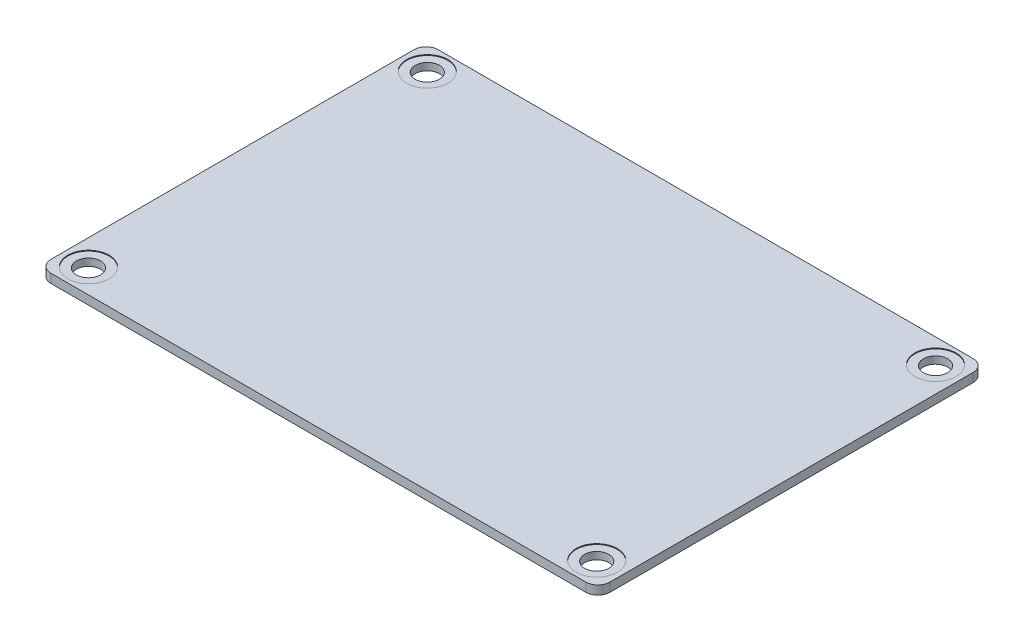
ISO-10303-21;
HEADER;
FILE_DESCRIPTION(('STEP AP214'),'2;1');
FILE_NAME('part.step','',(''),(''),'','','');
FILE_SCHEMA(('AUTOMOTIVE_DESIGN { 1 0 10303 214 1 1 1 1 }'));
ENDSEC;
DATA;
#1=APPLICATION_CONTEXT('core data for automotive mechanical design processes');
#2=APPLICATION_PROTOCOL_DEFINITION('international standard','automotive_design',2000,#1);
#3=PRODUCT_CONTEXT('',#1,'mechanical');
#4=PRODUCT('Part','Part','',(#3));
#5=PRODUCT_RELATED_PRODUCT_CATEGORY('part','',(#4));
#6=PRODUCT_DEFINITION_FORMATION('','',#4);
#7=PRODUCT_DEFINITION_CONTEXT('part definition',#1,'design');
#8=PRODUCT_DEFINITION('design','',#6,#7);
#9=PRODUCT_DEFINITION_SHAPE('','',#8);
#10=(LENGTH_UNIT() NAMED_UNIT(*) SI_UNIT(.MILLI.,.METRE.));
#11=(NAMED_UNIT(*) PLANE_ANGLE_UNIT() SI_UNIT($,.RADIAN.));
#12=(NAMED_UNIT(*) SI_UNIT($,.STERADIAN.) SOLID_ANGLE_UNIT());
#13=UNCERTAINTY_MEASURE_WITH_UNIT(LENGTH_MEASURE(1.E-05),#10,'distance_accuracy_value','');
#14=(GEOMETRIC_REPRESENTATION_CONTEXT(3) GLOBAL_UNCERTAINTY_ASSIGNED_CONTEXT((#13)) GLOBAL_UNIT_ASSIGNED_CONTEXT((#10,
#11,#12)) REPRESENTATION_CONTEXT('',''));
#15=CARTESIAN_POINT('',(0.,0.,0.));
#16=DIRECTION('',(0.,0.,1.));
#17=DIRECTION('',(1.,0.,0.));
#18=AXIS2_PLACEMENT_3D('',#15,#16,#17);
#19=CARTESIAN_POINT('',(-31.5,1.1,-21.));
#20=DIRECTION('',(0.,-1.,0.));
#21=DIRECTION('',(0.,0.,-1.));
#22=AXIS2_PLACEMENT_3D('',#19,#20,#21);
#23=CYLINDRICAL_SURFACE('',#22,2.55);
#24=CARTESIAN_POINT('',(-31.5,1.1,-21.));
#25=DIRECTION('',(0.,1.,0.));
#26=DIRECTION('',(0.,0.,1.));
#27=AXIS2_PLACEMENT_3D('',#24,#25,#26);
#28=CIRCLE('',#27,2.55);
#29=CARTESIAN_POINT('',(-31.5,1.1,-18.45));
#30=VERTEX_POINT('',#29);
#31=EDGE_CURVE('E142',#30,#30,#28,.T.);
#32=ORIENTED_EDGE('',*,*,#31,.T.);
#33=EDGE_LOOP('',(#32));
#34=FACE_BOUND('',#33,.T.);
#35=CARTESIAN_POINT('',(-31.5,1.,-21.));
#36=DIRECTION('',(0.,-1.,0.));
#37=DIRECTION('',(0.,0.,-1.));
#38=AXIS2_PLACEMENT_3D('',#35,#36,#37);
#39=CIRCLE('',#38,2.55);
#40=CARTESIAN_POINT('',(-31.5,1.,-23.55));
#41=VERTEX_POINT('',#40);
#42=EDGE_CURVE('E298',#41,#41,#39,.F.);
#43=ORIENTED_EDGE('',*,*,#42,.F.);
#44=EDGE_LOOP('',(#43));
#45=FACE_BOUND('',#44,.T.);
#46=ADVANCED_FACE('F39',(#34,#45),#23,.F.);
#47=CARTESIAN_POINT('',(31.5,1.1,-21.));
#48=DIRECTION('',(0.,-1.,0.));
#49=DIRECTION('',(0.,0.,-1.));
#50=AXIS2_PLACEMENT_3D('',#47,#48,#49);
#51=CYLINDRICAL_SURFACE('',#50,2.55);
#52=CARTESIAN_POINT('',(31.5,1.1,-21.));
#53=DIRECTION('',(0.,1.,0.));
#54=DIRECTION('',(0.,0.,1.));
#55=AXIS2_PLACEMENT_3D('',#52,#53,#54);
#56=CIRCLE('',#55,2.55);
#57=CARTESIAN_POINT('',(31.5,1.1,-18.45));
#58=VERTEX_POINT('',#57);
#59=EDGE_CURVE('E189',#58,#58,#56,.T.);
#60=ORIENTED_EDGE('',*,*,#59,.T.);
#61=EDGE_LOOP('',(#60));
#62=FACE_BOUND('',#61,.T.);
#63=CARTESIAN_POINT('',(31.5,1.,-21.));
#64=DIRECTION('',(0.,-1.,0.));
#65=DIRECTION('',(0.,0.,-1.));
#66=AXIS2_PLACEMENT_3D('',#63,#64,#65);
#67=CIRCLE('',#66,2.55);
#68=CARTESIAN_POINT('',(31.5,1.,-23.55));
#69=VERTEX_POINT('',#68);
#70=EDGE_CURVE('E289',#69,#69,#67,.F.);
#71=ORIENTED_EDGE('',*,*,#70,.F.);
#72=EDGE_LOOP('',(#71));
#73=FACE_BOUND('',#72,.T.);
#74=ADVANCED_FACE('F184',(#62,#73),#51,.F.);
#75=CARTESIAN_POINT('',(31.5,1.1,21.));
#76=DIRECTION('',(0.,-1.,0.));
#77=DIRECTION('',(0.,0.,-1.));
#78=AXIS2_PLACEMENT_3D('',#75,#76,#77);
#79=CYLINDRICAL_SURFACE('',#78,2.55);
#80=CARTESIAN_POINT('',(31.5,1.1,21.));
#81=DIRECTION('',(0.,1.,0.));
#82=DIRECTION('',(0.,0.,1.));
#83=AXIS2_PLACEMENT_3D('',#80,#81,#82);
#84=CIRCLE('',#83,2.55);
#85=CARTESIAN_POINT('',(31.5,1.1,23.55));
#86=VERTEX_POINT('',#85);
#87=EDGE_CURVE('E190',#86,#86,#84,.T.);
#88=ORIENTED_EDGE('',*,*,#87,.T.);
#89=EDGE_LOOP('',(#88));
#90=FACE_BOUND('',#89,.T.);
#91=CARTESIAN_POINT('',(31.5,1.,21.));
#92=DIRECTION('',(0.,-1.,0.));
#93=DIRECTION('',(0.,0.,-1.));
#94=AXIS2_PLACEMENT_3D('',#91,#92,#93);
#95=CIRCLE('',#94,2.55);
#96=CARTESIAN_POINT('',(31.5,1.,18.45));
#97=VERTEX_POINT('',#96);
#98=EDGE_CURVE('E280',#97,#97,#95,.F.);
#99=ORIENTED_EDGE('',*,*,#98,.F.);
#100=EDGE_LOOP('',(#99));
#101=FACE_BOUND('',#100,.T.);
#102=ADVANCED_FACE('F242',(#90,#101),#79,.F.);
#103=CARTESIAN_POINT('',(-31.5,1.1,21.));
#104=DIRECTION('',(0.,-1.,0.));
#105=DIRECTION('',(0.,0.,-1.));
#106=AXIS2_PLACEMENT_3D('',#103,#104,#105);
#107=CYLINDRICAL_SURFACE('',#106,2.55);
#108=CARTESIAN_POINT('',(-31.5,1.1,21.));
#109=DIRECTION('',(0.,1.,0.));
#110=DIRECTION('',(0.,0.,1.));
#111=AXIS2_PLACEMENT_3D('',#108,#109,#110);
#112=CIRCLE('',#111,2.55);
#113=CARTESIAN_POINT('',(-31.5,1.1,23.55));
#114=VERTEX_POINT('',#113);
#115=EDGE_CURVE('E261',#114,#114,#112,.T.);
#116=ORIENTED_EDGE('',*,*,#115,.T.);
#117=EDGE_LOOP('',(#116));
#118=FACE_BOUND('',#117,.T.);
#119=CARTESIAN_POINT('',(-31.5,1.,21.));
#120=DIRECTION('',(0.,-1.,0.));
#121=DIRECTION('',(0.,0.,-1.));
#122=AXIS2_PLACEMENT_3D('',#119,#120,#121);
#123=CIRCLE('',#122,2.55);
#124=CARTESIAN_POINT('',(-31.5,1.,18.45));
#125=VERTEX_POINT('',#124);
#126=EDGE_CURVE('E271',#125,#125,#123,.F.);
#127=ORIENTED_EDGE('',*,*,#126,.F.);
#128=EDGE_LOOP('',(#127));
#129=FACE_BOUND('',#128,.T.);
#130=ADVANCED_FACE('F248',(#118,#129),#107,.F.);
#131=CARTESIAN_POINT('',(-33.15,1.1,22.5));
#132=DIRECTION('',(0.,-1.,0.));
#133=DIRECTION('',(0.,0.,-1.));
#134=AXIS2_PLACEMENT_3D('',#131,#132,#133);
#135=PLANE('',#134);
#136=CARTESIAN_POINT('',(-33.15,1.1,22.5));
#137=DIRECTION('',(0.,1.,0.));
#138=DIRECTION('',(0.,0.,-1.));
#139=AXIS2_PLACEMENT_3D('',#136,#137,#138);
#140=CIRCLE('',#139,1.5);
#141=CARTESIAN_POINT('',(-34.65,1.1,22.5));
#142=VERTEX_POINT('',#141);
#143=CARTESIAN_POINT('',(-33.15,1.1,24.));
#144=VERTEX_POINT('',#143);
#145=EDGE_CURVE('E153',#142,#144,#140,.T.);
#146=ORIENTED_EDGE('',*,*,#145,.T.);
#147=DIRECTION('',(1.,0.,0.));
#148=VECTOR('',#147,1.);
#149=CARTESIAN_POINT('',(33.15,1.1,24.));
#150=LINE('',#149,#148);
#151=CARTESIAN_POINT('',(33.15,1.1,24.));
#152=VERTEX_POINT('',#151);
#153=EDGE_CURVE('E100',#144,#152,#150,.T.);
#154=ORIENTED_EDGE('',*,*,#153,.T.);
#155=CARTESIAN_POINT('',(33.15,1.1,22.5));
#156=DIRECTION('',(0.,1.,0.));
#157=DIRECTION('',(0.,0.,1.));
#158=AXIS2_PLACEMENT_3D('',#155,#156,#157);
#159=CIRCLE('',#158,1.5);
#160=CARTESIAN_POINT('',(34.65,1.1,22.5));
#161=VERTEX_POINT('',#160);
#162=EDGE_CURVE('E206',#152,#161,#159,.T.);
#163=ORIENTED_EDGE('',*,*,#162,.T.);
#164=DIRECTION('',(0.,0.,-1.));
#165=VECTOR('',#164,1.);
#166=CARTESIAN_POINT('',(34.65,1.1,22.5));
#167=LINE('',#166,#165);
#168=CARTESIAN_POINT('',(34.65,1.1,-22.5));
#169=VERTEX_POINT('',#168);
#170=EDGE_CURVE('E208',#161,#169,#167,.T.);
#171=ORIENTED_EDGE('',*,*,#170,.T.);
#172=CARTESIAN_POINT('',(33.15,1.1,-22.5));
#173=DIRECTION('',(0.,1.,0.));
#174=DIRECTION('',(0.,0.,1.));
#175=AXIS2_PLACEMENT_3D('',#172,#173,#174);
#176=CIRCLE('',#175,1.5);
#177=CARTESIAN_POINT('',(33.15,1.1,-24.));
#178=VERTEX_POINT('',#177);
#179=EDGE_CURVE('E120',#169,#178,#176,.T.);
#180=ORIENTED_EDGE('',*,*,#179,.T.);
#181=DIRECTION('',(-1.,0.,0.));
#182=VECTOR('',#181,1.);
#183=CARTESIAN_POINT('',(33.15,1.1,-24.));
#184=LINE('',#183,#182);
#185=CARTESIAN_POINT('',(-33.15,1.1,-24.));
#186=VERTEX_POINT('',#185);
#187=EDGE_CURVE('E113',#178,#186,#184,.T.);
#188=ORIENTED_EDGE('',*,*,#187,.T.);
#189=CARTESIAN_POINT('',(-33.15,1.1,-22.5));
#190=DIRECTION('',(0.,1.,0.));
#191=DIRECTION('',(0.,0.,1.));
#192=AXIS2_PLACEMENT_3D('',#189,#190,#191);
#193=CIRCLE('',#192,1.5);
#194=CARTESIAN_POINT('',(-34.65,1.1,-22.5));
#195=VERTEX_POINT('',#194);
#196=EDGE_CURVE('E118',#186,#195,#193,.T.);
#197=ORIENTED_EDGE('',*,*,#196,.T.);
#198=DIRECTION('',(0.,0.,1.));
#199=VECTOR('',#198,1.);
#200=CARTESIAN_POINT('',(-34.65,1.1,22.5));
#201=LINE('',#200,#199);
#202=EDGE_CURVE('E56',#195,#142,#201,.T.);
#203=ORIENTED_EDGE('',*,*,#202,.T.);
#204=EDGE_LOOP('',(#146,#154,#163,#171,#180,#188,#197,#203));
#205=FACE_BOUND('',#204,.T.);
#206=ORIENTED_EDGE('',*,*,#31,.F.);
#207=EDGE_LOOP('',(#206));
#208=FACE_BOUND('',#207,.T.);
#209=ORIENTED_EDGE('',*,*,#59,.F.);
#210=EDGE_LOOP('',(#209));
#211=FACE_BOUND('',#210,.T.);
#212=ORIENTED_EDGE('',*,*,#87,.F.);
#213=EDGE_LOOP('',(#212));
#214=FACE_BOUND('',#213,.T.);
#215=ORIENTED_EDGE('',*,*,#115,.F.);
#216=EDGE_LOOP('',(#215));
#217=FACE_BOUND('',#216,.T.);
#218=ADVANCED_FACE('F115',(#205,#208,#211,#214,#217),#135,.F.);
#219=CARTESIAN_POINT('',(-33.15,0.,22.5));
#220=DIRECTION('',(0.,-1.,0.));
#221=DIRECTION('',(0.,0.,-1.));
#222=AXIS2_PLACEMENT_3D('',#219,#220,#221);
#223=PLANE('',#222);
#224=CARTESIAN_POINT('',(31.5,0.,21.));
#225=DIRECTION('',(0.,1.,0.));
#226=DIRECTION('',(0.,0.,1.));
#227=AXIS2_PLACEMENT_3D('',#224,#225,#226);
#228=CIRCLE('',#227,2.55);
#229=CARTESIAN_POINT('',(31.5,0.,23.55));
#230=VERTEX_POINT('',#229);
#231=EDGE_CURVE('E196',#230,#230,#228,.T.);
#232=ORIENTED_EDGE('',*,*,#231,.T.);
#233=EDGE_LOOP('',(#232));
#234=FACE_BOUND('',#233,.T.);
#235=CARTESIAN_POINT('',(-31.5,0.,-21.));
#236=DIRECTION('',(0.,1.,0.));
#237=DIRECTION('',(0.,0.,1.));
#238=AXIS2_PLACEMENT_3D('',#235,#236,#237);
#239=CIRCLE('',#238,2.55);
#240=CARTESIAN_POINT('',(-31.5,0.,-18.45));
#241=VERTEX_POINT('',#240);
#242=EDGE_CURVE('E193',#241,#241,#239,.T.);
#243=ORIENTED_EDGE('',*,*,#242,.T.);
#244=EDGE_LOOP('',(#243));
#245=FACE_BOUND('',#244,.T.);
#246=CARTESIAN_POINT('',(-33.15,0.,22.5));
#247=DIRECTION('',(0.,1.,0.));
#248=DIRECTION('',(0.,0.,-1.));
#249=AXIS2_PLACEMENT_3D('',#246,#247,#248);
#250=CIRCLE('',#249,1.5);
#251=CARTESIAN_POINT('',(-34.65,0.,22.5));
#252=VERTEX_POINT('',#251);
#253=CARTESIAN_POINT('',(-33.15,0.,24.));
#254=VERTEX_POINT('',#253);
#255=EDGE_CURVE('E138',#252,#254,#250,.T.);
#256=ORIENTED_EDGE('',*,*,#255,.F.);
#257=DIRECTION('',(0.,0.,1.));
#258=VECTOR('',#257,1.);
#259=CARTESIAN_POINT('',(-34.65,0.,22.5));
#260=LINE('',#259,#258);
#261=CARTESIAN_POINT('',(-34.65,0.,-22.5));
#262=VERTEX_POINT('',#261);
#263=EDGE_CURVE('E91',#262,#252,#260,.T.);
#264=ORIENTED_EDGE('',*,*,#263,.F.);
#265=CARTESIAN_POINT('',(-33.15,0.,-22.5));
#266=DIRECTION('',(0.,1.,0.));
#267=DIRECTION('',(0.,0.,1.));
#268=AXIS2_PLACEMENT_3D('',#265,#266,#267);
#269=CIRCLE('',#268,1.5);
#270=CARTESIAN_POINT('',(-33.15,0.,-24.));
#271=VERTEX_POINT('',#270);
#272=EDGE_CURVE('E85',#271,#262,#269,.T.);
#273=ORIENTED_EDGE('',*,*,#272,.F.);
#274=DIRECTION('',(-1.,0.,0.));
#275=VECTOR('',#274,1.);
#276=CARTESIAN_POINT('',(33.15,0.,-24.));
#277=LINE('',#276,#275);
#278=CARTESIAN_POINT('',(33.15,0.,-24.));
#279=VERTEX_POINT('',#278);
#280=EDGE_CURVE('E128',#279,#271,#277,.T.);
#281=ORIENTED_EDGE('',*,*,#280,.F.);
#282=CARTESIAN_POINT('',(33.15,0.,-22.5));
#283=DIRECTION('',(0.,1.,0.));
#284=DIRECTION('',(0.,0.,1.));
#285=AXIS2_PLACEMENT_3D('',#282,#283,#284);
#286=CIRCLE('',#285,1.5);
#287=CARTESIAN_POINT('',(34.65,0.,-22.5));
#288=VERTEX_POINT('',#287);
#289=EDGE_CURVE('E148',#288,#279,#286,.T.);
#290=ORIENTED_EDGE('',*,*,#289,.F.);
#291=DIRECTION('',(0.,0.,-1.));
#292=VECTOR('',#291,1.);
#293=CARTESIAN_POINT('',(34.65,0.,22.5));
#294=LINE('',#293,#292);
#295=CARTESIAN_POINT('',(34.65,0.,22.5));
#296=VERTEX_POINT('',#295);
#297=EDGE_CURVE('E146',#296,#288,#294,.T.);
#298=ORIENTED_EDGE('',*,*,#297,.F.);
#299=CARTESIAN_POINT('',(33.15,0.,22.5));
#300=DIRECTION('',(0.,1.,0.));
#301=DIRECTION('',(0.,0.,1.));
#302=AXIS2_PLACEMENT_3D('',#299,#300,#301);
#303=CIRCLE('',#302,1.5);
#304=CARTESIAN_POINT('',(33.15,0.,24.));
#305=VERTEX_POINT('',#304);
#306=EDGE_CURVE('E144',#305,#296,#303,.T.);
#307=ORIENTED_EDGE('',*,*,#306,.F.);
#308=DIRECTION('',(1.,0.,0.));
#309=VECTOR('',#308,1.);
#310=CARTESIAN_POINT('',(33.15,0.,24.));
#311=LINE('',#310,#309);
#312=EDGE_CURVE('E141',#254,#305,#311,.T.);
#313=ORIENTED_EDGE('',*,*,#312,.F.);
#314=EDGE_LOOP('',(#256,#264,#273,#281,#290,#298,#307,#313));
#315=FACE_BOUND('',#314,.T.);
#316=CARTESIAN_POINT('',(31.5,0.,-21.));
#317=DIRECTION('',(0.,1.,0.));
#318=DIRECTION('',(0.,0.,1.));
#319=AXIS2_PLACEMENT_3D('',#316,#317,#318);
#320=CIRCLE('',#319,2.55);
#321=CARTESIAN_POINT('',(31.5,0.,-18.45));
#322=VERTEX_POINT('',#321);
#323=EDGE_CURVE('E187',#322,#322,#320,.T.);
#324=ORIENTED_EDGE('',*,*,#323,.T.);
#325=EDGE_LOOP('',(#324));
#326=FACE_BOUND('',#325,.T.);
#327=CARTESIAN_POINT('',(-31.5,0.,21.));
#328=DIRECTION('',(0.,1.,0.));
#329=DIRECTION('',(0.,0.,1.));
#330=AXIS2_PLACEMENT_3D('',#327,#328,#329);
#331=CIRCLE('',#330,2.55);
#332=CARTESIAN_POINT('',(-31.5,0.,23.55));
#333=VERTEX_POINT('',#332);
#334=EDGE_CURVE('E263',#333,#333,#331,.T.);
#335=ORIENTED_EDGE('',*,*,#334,.T.);
#336=EDGE_LOOP('',(#335));
#337=FACE_BOUND('',#336,.T.);
#338=ADVANCED_FACE('F221',(#234,#245,#315,#326,#337),#223,.T.);
#339=CARTESIAN_POINT('',(-33.15,1.1,22.5));
#340=DIRECTION('',(0.,-1.,0.));
#341=DIRECTION('',(0.,0.,-1.));
#342=AXIS2_PLACEMENT_3D('',#339,#340,#341);
#343=CYLINDRICAL_SURFACE('',#342,1.5);
#344=ORIENTED_EDGE('',*,*,#255,.T.);
#345=DIRECTION('',(0.,-1.,0.));
#346=VECTOR('',#345,1.);
#347=CARTESIAN_POINT('',(-33.15,1.1,24.));
#348=LINE('',#347,#346);
#349=EDGE_CURVE('E166',#144,#254,#348,.T.);
#350=ORIENTED_EDGE('',*,*,#349,.F.);
#351=ORIENTED_EDGE('',*,*,#145,.F.);
#352=DIRECTION('',(0.,-1.,0.));
#353=VECTOR('',#352,1.);
#354=CARTESIAN_POINT('',(-34.65,1.1,22.5));
#355=LINE('',#354,#353);
#356=EDGE_CURVE('E134',#142,#252,#355,.T.);
#357=ORIENTED_EDGE('',*,*,#356,.T.);
#358=EDGE_LOOP('',(#344,#350,#351,#357));
#359=FACE_BOUND('',#358,.T.);
#360=ADVANCED_FACE('F41',(#359),#343,.T.);
#361=CARTESIAN_POINT('',(33.15,1.1,24.));
#362=DIRECTION('',(0.,0.,-1.));
#363=DIRECTION('',(-1.,0.,0.));
#364=AXIS2_PLACEMENT_3D('',#361,#362,#363);
#365=PLANE('',#364);
#366=ORIENTED_EDGE('',*,*,#312,.T.);
#367=DIRECTION('',(0.,-1.,0.));
#368=VECTOR('',#367,1.);
#369=CARTESIAN_POINT('',(33.15,1.1,24.));
#370=LINE('',#369,#368);
#371=EDGE_CURVE('E163',#152,#305,#370,.T.);
#372=ORIENTED_EDGE('',*,*,#371,.F.);
#373=ORIENTED_EDGE('',*,*,#153,.F.);
#374=ORIENTED_EDGE('',*,*,#349,.T.);
#375=EDGE_LOOP('',(#366,#372,#373,#374));
#376=FACE_BOUND('',#375,.T.);
#377=ADVANCED_FACE('F254',(#376),#365,.F.);
#378=CARTESIAN_POINT('',(33.15,1.1,22.5));
#379=DIRECTION('',(0.,-1.,0.));
#380=DIRECTION('',(0.,0.,-1.));
#381=AXIS2_PLACEMENT_3D('',#378,#379,#380);
#382=CYLINDRICAL_SURFACE('',#381,1.5);
#383=ORIENTED_EDGE('',*,*,#306,.T.);
#384=DIRECTION('',(0.,-1.,0.));
#385=VECTOR('',#384,1.);
#386=CARTESIAN_POINT('',(34.65,1.1,22.5));
#387=LINE('',#386,#385);
#388=EDGE_CURVE('E160',#161,#296,#387,.T.);
#389=ORIENTED_EDGE('',*,*,#388,.F.);
#390=ORIENTED_EDGE('',*,*,#162,.F.);
#391=ORIENTED_EDGE('',*,*,#371,.T.);
#392=EDGE_LOOP('',(#383,#389,#390,#391));
#393=FACE_BOUND('',#392,.T.);
#394=ADVANCED_FACE('F422',(#393),#382,.T.);
#395=CARTESIAN_POINT('',(34.65,1.1,22.5));
#396=DIRECTION('',(-1.,0.,0.));
#397=DIRECTION('',(0.,0.,1.));
#398=AXIS2_PLACEMENT_3D('',#395,#396,#397);
#399=PLANE('',#398);
#400=ORIENTED_EDGE('',*,*,#297,.T.);
#401=DIRECTION('',(0.,-1.,0.));
#402=VECTOR('',#401,1.);
#403=CARTESIAN_POINT('',(34.65,1.1,-22.5));
#404=LINE('',#403,#402);
#405=EDGE_CURVE('E157',#169,#288,#404,.T.);
#406=ORIENTED_EDGE('',*,*,#405,.F.);
#407=ORIENTED_EDGE('',*,*,#170,.F.);
#408=ORIENTED_EDGE('',*,*,#388,.T.);
#409=EDGE_LOOP('',(#400,#406,#407,#408));
#410=FACE_BOUND('',#409,.T.);
#411=ADVANCED_FACE('F214',(#410),#399,.F.);
#412=CARTESIAN_POINT('',(33.15,1.1,-22.5));
#413=DIRECTION('',(0.,-1.,0.));
#414=DIRECTION('',(0.,0.,-1.));
#415=AXIS2_PLACEMENT_3D('',#412,#413,#414);
#416=CYLINDRICAL_SURFACE('',#415,1.5);
#417=ORIENTED_EDGE('',*,*,#289,.T.);
#418=DIRECTION('',(0.,-1.,0.));
#419=VECTOR('',#418,1.);
#420=CARTESIAN_POINT('',(33.15,1.1,-24.));
#421=LINE('',#420,#419);
#422=EDGE_CURVE('E129',#178,#279,#421,.T.);
#423=ORIENTED_EDGE('',*,*,#422,.F.);
#424=ORIENTED_EDGE('',*,*,#179,.F.);
#425=ORIENTED_EDGE('',*,*,#405,.T.);
#426=EDGE_LOOP('',(#417,#423,#424,#425));
#427=FACE_BOUND('',#426,.T.);
#428=ADVANCED_FACE('F218',(#427),#416,.T.);
#429=CARTESIAN_POINT('',(33.15,1.1,-24.));
#430=DIRECTION('',(0.,0.,1.));
#431=DIRECTION('',(1.,0.,0.));
#432=AXIS2_PLACEMENT_3D('',#429,#430,#431);
#433=PLANE('',#432);
#434=ORIENTED_EDGE('',*,*,#280,.T.);
#435=DIRECTION('',(0.,-1.,0.));
#436=VECTOR('',#435,1.);
#437=CARTESIAN_POINT('',(-33.15,1.1,-24.));
#438=LINE('',#437,#436);
#439=EDGE_CURVE('E125',#186,#271,#438,.T.);
#440=ORIENTED_EDGE('',*,*,#439,.F.);
#441=ORIENTED_EDGE('',*,*,#187,.F.);
#442=ORIENTED_EDGE('',*,*,#422,.T.);
#443=EDGE_LOOP('',(#434,#440,#441,#442));
#444=FACE_BOUND('',#443,.T.);
#445=ADVANCED_FACE('F126',(#444),#433,.F.);
#446=CARTESIAN_POINT('',(-33.15,1.1,-22.5));
#447=DIRECTION('',(0.,-1.,0.));
#448=DIRECTION('',(0.,0.,-1.));
#449=AXIS2_PLACEMENT_3D('',#446,#447,#448);
#450=CYLINDRICAL_SURFACE('',#449,1.5);
#451=ORIENTED_EDGE('',*,*,#272,.T.);
#452=DIRECTION('',(0.,-1.,0.));
#453=VECTOR('',#452,1.);
#454=CARTESIAN_POINT('',(-34.65,1.1,-22.5));
#455=LINE('',#454,#453);
#456=EDGE_CURVE('E130',#195,#262,#455,.T.);
#457=ORIENTED_EDGE('',*,*,#456,.F.);
#458=ORIENTED_EDGE('',*,*,#196,.F.);
#459=ORIENTED_EDGE('',*,*,#439,.T.);
#460=EDGE_LOOP('',(#451,#457,#458,#459));
#461=FACE_BOUND('',#460,.T.);
#462=ADVANCED_FACE('F132',(#461),#450,.T.);
#463=CARTESIAN_POINT('',(-34.65,1.1,22.5));
#464=DIRECTION('',(1.,0.,0.));
#465=DIRECTION('',(0.,0.,-1.));
#466=AXIS2_PLACEMENT_3D('',#463,#464,#465);
#467=PLANE('',#466);
#468=ORIENTED_EDGE('',*,*,#263,.T.);
#469=ORIENTED_EDGE('',*,*,#356,.F.);
#470=ORIENTED_EDGE('',*,*,#202,.F.);
#471=ORIENTED_EDGE('',*,*,#456,.T.);
#472=EDGE_LOOP('',(#468,#469,#470,#471));
#473=FACE_BOUND('',#472,.T.);
#474=ADVANCED_FACE('F226',(#473),#467,.F.);
#475=CARTESIAN_POINT('',(-31.5,0.1,-21.));
#476=DIRECTION('',(0.,-1.,0.));
#477=DIRECTION('',(0.,0.,-1.));
#478=AXIS2_PLACEMENT_3D('',#475,#476,#477);
#479=CIRCLE('',#478,2.55);
#480=CARTESIAN_POINT('',(-31.5,0.1,-23.55));
#481=VERTEX_POINT('',#480);
#482=EDGE_CURVE('E12',#481,#481,#479,.T.);
#483=ORIENTED_EDGE('',*,*,#482,.F.);
#484=EDGE_LOOP('',(#483));
#485=FACE_BOUND('',#484,.T.);
#486=ORIENTED_EDGE('',*,*,#242,.F.);
#487=EDGE_LOOP('',(#486));
#488=FACE_BOUND('',#487,.T.);
#489=ADVANCED_FACE('F182',(#485,#488),#23,.F.);
#490=CARTESIAN_POINT('',(31.5,0.1,-21.));
#491=DIRECTION('',(0.,-1.,0.));
#492=DIRECTION('',(0.,0.,-1.));
#493=AXIS2_PLACEMENT_3D('',#490,#491,#492);
#494=CIRCLE('',#493,2.55);
#495=CARTESIAN_POINT('',(31.5,0.1,-23.55));
#496=VERTEX_POINT('',#495);
#497=EDGE_CURVE('E48',#496,#496,#494,.T.);
#498=ORIENTED_EDGE('',*,*,#497,.F.);
#499=EDGE_LOOP('',(#498));
#500=FACE_BOUND('',#499,.T.);
#501=ORIENTED_EDGE('',*,*,#323,.F.);
#502=EDGE_LOOP('',(#501));
#503=FACE_BOUND('',#502,.T.);
#504=ADVANCED_FACE('F178',(#500,#503),#51,.F.);
#505=CARTESIAN_POINT('',(31.5,0.1,21.));
#506=DIRECTION('',(0.,-1.,0.));
#507=DIRECTION('',(0.,0.,-1.));
#508=AXIS2_PLACEMENT_3D('',#505,#506,#507);
#509=CIRCLE('',#508,2.55);
#510=CARTESIAN_POINT('',(31.5,0.1,18.45));
#511=VERTEX_POINT('',#510);
#512=EDGE_CURVE('E171',#511,#511,#509,.T.);
#513=ORIENTED_EDGE('',*,*,#512,.F.);
#514=EDGE_LOOP('',(#513));
#515=FACE_BOUND('',#514,.T.);
#516=ORIENTED_EDGE('',*,*,#231,.F.);
#517=EDGE_LOOP('',(#516));
#518=FACE_BOUND('',#517,.T.);
#519=ADVANCED_FACE('F181',(#515,#518),#79,.F.);
#520=CARTESIAN_POINT('',(-31.5,0.1,21.));
#521=DIRECTION('',(0.,-1.,0.));
#522=DIRECTION('',(0.,0.,-1.));
#523=AXIS2_PLACEMENT_3D('',#520,#521,#522);
#524=CIRCLE('',#523,2.55);
#525=CARTESIAN_POINT('',(-31.5,0.1,18.45));
#526=VERTEX_POINT('',#525);
#527=EDGE_CURVE('E168',#526,#526,#524,.T.);
#528=ORIENTED_EDGE('',*,*,#527,.F.);
#529=EDGE_LOOP('',(#528));
#530=FACE_BOUND('',#529,.T.);
#531=ORIENTED_EDGE('',*,*,#334,.F.);
#532=EDGE_LOOP('',(#531));
#533=FACE_BOUND('',#532,.T.);
#534=ADVANCED_FACE('F359',(#530,#533),#107,.F.);
#535=CARTESIAN_POINT('',(-31.5,0.1,21.));
#536=DIRECTION('',(0.,-1.,0.));
#537=DIRECTION('',(0.,0.,-1.));
#538=AXIS2_PLACEMENT_3D('',#535,#536,#537);
#539=PLANE('',#538);
#540=CARTESIAN_POINT('',(-31.5,0.1,21.));
#541=DIRECTION('',(0.,-1.,0.));
#542=DIRECTION('',(0.,0.,-1.));
#543=AXIS2_PLACEMENT_3D('',#540,#541,#542);
#544=CIRCLE('',#543,1.5);
#545=CARTESIAN_POINT('',(-31.5,0.1,19.5));
#546=VERTEX_POINT('',#545);
#547=EDGE_CURVE('E272',#546,#546,#544,.T.);
#548=ORIENTED_EDGE('',*,*,#547,.F.);
#549=EDGE_LOOP('',(#548));
#550=FACE_BOUND('',#549,.T.);
#551=ORIENTED_EDGE('',*,*,#527,.T.);
#552=EDGE_LOOP('',(#551));
#553=FACE_BOUND('',#552,.T.);
#554=ADVANCED_FACE('F355',(#550,#553),#539,.T.);
#555=CARTESIAN_POINT('',(-31.5,8.31248916810278,21.));
#556=DIRECTION('',(0.,-1.,0.));
#557=DIRECTION('',(0.,0.,-1.));
#558=AXIS2_PLACEMENT_3D('',#555,#556,#557);
#559=CYLINDRICAL_SURFACE('',#558,1.5);
#560=CARTESIAN_POINT('',(-31.5,1.,21.));
#561=DIRECTION('',(0.,-1.,0.));
#562=DIRECTION('',(0.,0.,-1.));
#563=AXIS2_PLACEMENT_3D('',#560,#561,#562);
#564=CIRCLE('',#563,1.5);
#565=CARTESIAN_POINT('',(-31.5,1.,19.5));
#566=VERTEX_POINT('',#565);
#567=EDGE_CURVE('E267',#566,#566,#564,.F.);
#568=ORIENTED_EDGE('',*,*,#567,.T.);
#569=EDGE_LOOP('',(#568));
#570=FACE_BOUND('',#569,.T.);
#571=ORIENTED_EDGE('',*,*,#547,.T.);
#572=EDGE_LOOP('',(#571));
#573=FACE_BOUND('',#572,.T.);
#574=ADVANCED_FACE('F351',(#570,#573),#559,.F.);
#575=CARTESIAN_POINT('',(-33.15,1.,22.5));
#576=DIRECTION('',(0.,-1.,0.));
#577=DIRECTION('',(0.,0.,-1.));
#578=AXIS2_PLACEMENT_3D('',#575,#576,#577);
#579=PLANE('',#578);
#580=ORIENTED_EDGE('',*,*,#126,.T.);
#581=EDGE_LOOP('',(#580));
#582=FACE_BOUND('',#581,.T.);
#583=ORIENTED_EDGE('',*,*,#567,.F.);
#584=EDGE_LOOP('',(#583));
#585=FACE_BOUND('',#584,.T.);
#586=ADVANCED_FACE('F347',(#582,#585),#579,.F.);
#587=CARTESIAN_POINT('',(31.5,0.1,21.));
#588=DIRECTION('',(0.,-1.,0.));
#589=DIRECTION('',(0.,0.,-1.));
#590=AXIS2_PLACEMENT_3D('',#587,#588,#589);
#591=PLANE('',#590);
#592=CARTESIAN_POINT('',(31.5,0.1,21.));
#593=DIRECTION('',(0.,-1.,0.));
#594=DIRECTION('',(0.,0.,-1.));
#595=AXIS2_PLACEMENT_3D('',#592,#593,#594);
#596=CIRCLE('',#595,1.5);
#597=CARTESIAN_POINT('',(31.5,0.1,19.5));
#598=VERTEX_POINT('',#597);
#599=EDGE_CURVE('E281',#598,#598,#596,.T.);
#600=ORIENTED_EDGE('',*,*,#599,.F.);
#601=EDGE_LOOP('',(#600));
#602=FACE_BOUND('',#601,.T.);
#603=ORIENTED_EDGE('',*,*,#512,.T.);
#604=EDGE_LOOP('',(#603));
#605=FACE_BOUND('',#604,.T.);
#606=ADVANCED_FACE('F343',(#602,#605),#591,.T.);
#607=CARTESIAN_POINT('',(31.5,8.31248916810278,21.));
#608=DIRECTION('',(0.,-1.,0.));
#609=DIRECTION('',(0.,0.,-1.));
#610=AXIS2_PLACEMENT_3D('',#607,#608,#609);
#611=CYLINDRICAL_SURFACE('',#610,1.5);
#612=CARTESIAN_POINT('',(31.5,1.,21.));
#613=DIRECTION('',(0.,-1.,0.));
#614=DIRECTION('',(0.,0.,-1.));
#615=AXIS2_PLACEMENT_3D('',#612,#613,#614);
#616=CIRCLE('',#615,1.5);
#617=CARTESIAN_POINT('',(31.5,1.,19.5));
#618=VERTEX_POINT('',#617);
#619=EDGE_CURVE('E275',#618,#618,#616,.F.);
#620=ORIENTED_EDGE('',*,*,#619,.T.);
#621=EDGE_LOOP('',(#620));
#622=FACE_BOUND('',#621,.T.);
#623=ORIENTED_EDGE('',*,*,#599,.T.);
#624=EDGE_LOOP('',(#623));
#625=FACE_BOUND('',#624,.T.);
#626=ADVANCED_FACE('F339',(#622,#625),#611,.F.);
#627=CARTESIAN_POINT('',(-33.15,1.,22.5));
#628=DIRECTION('',(0.,-1.,0.));
#629=DIRECTION('',(0.,0.,-1.));
#630=AXIS2_PLACEMENT_3D('',#627,#628,#629);
#631=PLANE('',#630);
#632=ORIENTED_EDGE('',*,*,#98,.T.);
#633=EDGE_LOOP('',(#632));
#634=FACE_BOUND('',#633,.T.);
#635=ORIENTED_EDGE('',*,*,#619,.F.);
#636=EDGE_LOOP('',(#635));
#637=FACE_BOUND('',#636,.T.);
#638=ADVANCED_FACE('F335',(#634,#637),#631,.F.);
#639=CARTESIAN_POINT('',(31.5,0.1,-21.));
#640=DIRECTION('',(0.,-1.,0.));
#641=DIRECTION('',(0.,0.,-1.));
#642=AXIS2_PLACEMENT_3D('',#639,#640,#641);
#643=PLANE('',#642);
#644=CARTESIAN_POINT('',(31.5,0.1,-21.));
#645=DIRECTION('',(0.,-1.,0.));
#646=DIRECTION('',(0.,0.,-1.));
#647=AXIS2_PLACEMENT_3D('',#644,#645,#646);
#648=CIRCLE('',#647,1.5);
#649=CARTESIAN_POINT('',(31.5,0.1,-22.5));
#650=VERTEX_POINT('',#649);
#651=EDGE_CURVE('E290',#650,#650,#648,.T.);
#652=ORIENTED_EDGE('',*,*,#651,.F.);
#653=EDGE_LOOP('',(#652));
#654=FACE_BOUND('',#653,.T.);
#655=ORIENTED_EDGE('',*,*,#497,.T.);
#656=EDGE_LOOP('',(#655));
#657=FACE_BOUND('',#656,.T.);
#658=ADVANCED_FACE('F176',(#654,#657),#643,.T.);
#659=CARTESIAN_POINT('',(31.5,8.31248916810278,-21.));
#660=DIRECTION('',(0.,-1.,0.));
#661=DIRECTION('',(0.,0.,-1.));
#662=AXIS2_PLACEMENT_3D('',#659,#660,#661);
#663=CYLINDRICAL_SURFACE('',#662,1.5);
#664=CARTESIAN_POINT('',(31.5,1.,-21.));
#665=DIRECTION('',(0.,-1.,0.));
#666=DIRECTION('',(0.,0.,-1.));
#667=AXIS2_PLACEMENT_3D('',#664,#665,#666);
#668=CIRCLE('',#667,1.5);
#669=CARTESIAN_POINT('',(31.5,1.,-22.5));
#670=VERTEX_POINT('',#669);
#671=EDGE_CURVE('E284',#670,#670,#668,.F.);
#672=ORIENTED_EDGE('',*,*,#671,.T.);
#673=EDGE_LOOP('',(#672));
#674=FACE_BOUND('',#673,.T.);
#675=ORIENTED_EDGE('',*,*,#651,.T.);
#676=EDGE_LOOP('',(#675));
#677=FACE_BOUND('',#676,.T.);
#678=ADVANCED_FACE('F326',(#674,#677),#663,.F.);
#679=CARTESIAN_POINT('',(-33.15,1.,22.5));
#680=DIRECTION('',(0.,-1.,0.));
#681=DIRECTION('',(0.,0.,-1.));
#682=AXIS2_PLACEMENT_3D('',#679,#680,#681);
#683=PLANE('',#682);
#684=ORIENTED_EDGE('',*,*,#70,.T.);
#685=EDGE_LOOP('',(#684));
#686=FACE_BOUND('',#685,.T.);
#687=ORIENTED_EDGE('',*,*,#671,.F.);
#688=EDGE_LOOP('',(#687));
#689=FACE_BOUND('',#688,.T.);
#690=ADVANCED_FACE('F320',(#686,#689),#683,.F.);
#691=CARTESIAN_POINT('',(-31.5,0.1,-21.));
#692=DIRECTION('',(0.,-1.,0.));
#693=DIRECTION('',(0.,0.,-1.));
#694=AXIS2_PLACEMENT_3D('',#691,#692,#693);
#695=PLANE('',#694);
#696=CARTESIAN_POINT('',(-31.5,0.1,-21.));
#697=DIRECTION('',(0.,-1.,0.));
#698=DIRECTION('',(0.,0.,-1.));
#699=AXIS2_PLACEMENT_3D('',#696,#697,#698);
#700=CIRCLE('',#699,1.5);
#701=CARTESIAN_POINT('',(-31.5,0.1,-22.5));
#702=VERTEX_POINT('',#701);
#703=EDGE_CURVE('E299',#702,#702,#700,.T.);
#704=ORIENTED_EDGE('',*,*,#703,.F.);
#705=EDGE_LOOP('',(#704));
#706=FACE_BOUND('',#705,.T.);
#707=ORIENTED_EDGE('',*,*,#482,.T.);
#708=EDGE_LOOP('',(#707));
#709=FACE_BOUND('',#708,.T.);
#710=ADVANCED_FACE('F314',(#706,#709),#695,.T.);
#711=CARTESIAN_POINT('',(-31.5,8.31248916810278,-21.));
#712=DIRECTION('',(0.,-1.,0.));
#713=DIRECTION('',(0.,0.,-1.));
#714=AXIS2_PLACEMENT_3D('',#711,#712,#713);
#715=CYLINDRICAL_SURFACE('',#714,1.5);
#716=CARTESIAN_POINT('',(-31.5,1.,-21.));
#717=DIRECTION('',(0.,-1.,0.));
#718=DIRECTION('',(0.,0.,-1.));
#719=AXIS2_PLACEMENT_3D('',#716,#717,#718);
#720=CIRCLE('',#719,1.5);
#721=CARTESIAN_POINT('',(-31.5,1.,-22.5));
#722=VERTEX_POINT('',#721);
#723=EDGE_CURVE('E293',#722,#722,#720,.F.);
#724=ORIENTED_EDGE('',*,*,#723,.T.);
#725=EDGE_LOOP('',(#724));
#726=FACE_BOUND('',#725,.T.);
#727=ORIENTED_EDGE('',*,*,#703,.T.);
#728=EDGE_LOOP('',(#727));
#729=FACE_BOUND('',#728,.T.);
#730=ADVANCED_FACE('F308',(#726,#729),#715,.F.);
#731=CARTESIAN_POINT('',(-33.15,1.,22.5));
#732=DIRECTION('',(0.,-1.,0.));
#733=DIRECTION('',(0.,0.,-1.));
#734=AXIS2_PLACEMENT_3D('',#731,#732,#733);
#735=PLANE('',#734);
#736=ORIENTED_EDGE('',*,*,#42,.T.);
#737=EDGE_LOOP('',(#736));
#738=FACE_BOUND('',#737,.T.);
#739=ORIENTED_EDGE('',*,*,#723,.F.);
#740=EDGE_LOOP('',(#739));
#741=FACE_BOUND('',#740,.T.);
#742=ADVANCED_FACE('F305',(#738,#741),#735,.F.);
#743=CLOSED_SHELL('',(#46,#74,#102,#130,#218,#338,#360,#377,#394,#411,#428,#445,#462,#474,#489,
#504,#519,#534,#554,#574,#586,#606,#626,#638,#658,#678,#690,#710,#730,#742));
#744=MANIFOLD_SOLID_BREP('B2',#743);
#745=ADVANCED_BREP_SHAPE_REPRESENTATION('',(#18,#744),#14);
#746=SHAPE_DEFINITION_REPRESENTATION(#9,#745);
ENDSEC;
END-ISO-10303-21;
